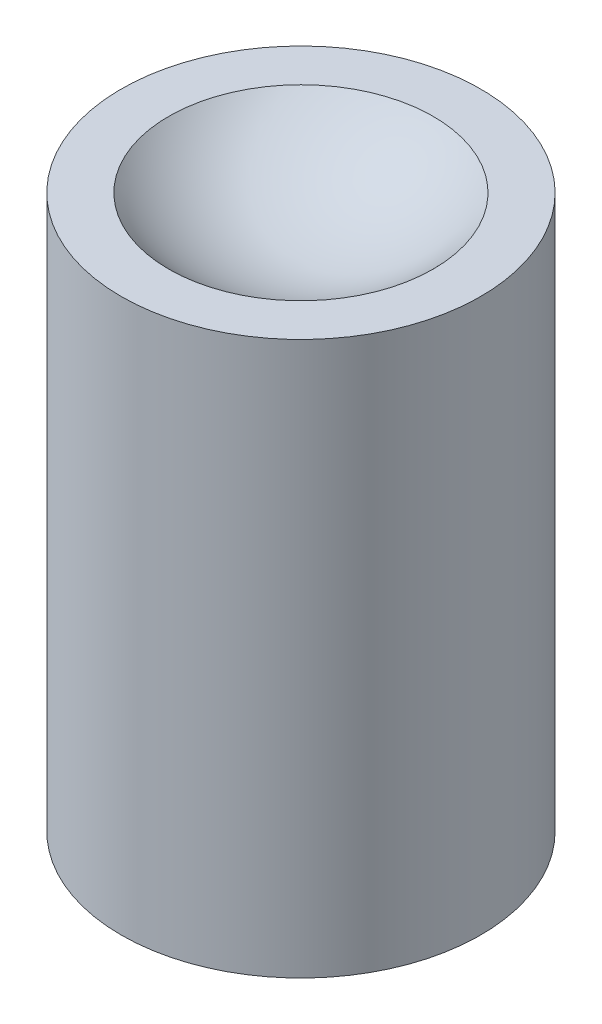
ISO-10303-21;
HEADER;
FILE_DESCRIPTION(('STEP AP214'),'2;1');
FILE_NAME('part.step','',(''),(''),'','','');
FILE_SCHEMA(('AUTOMOTIVE_DESIGN { 1 0 10303 214 1 1 1 1 }'));
ENDSEC;
DATA;
#1=APPLICATION_CONTEXT('core data for automotive mechanical design processes');
#2=APPLICATION_PROTOCOL_DEFINITION('international standard','automotive_design',2000,#1);
#3=PRODUCT_CONTEXT('',#1,'mechanical');
#4=PRODUCT('Part','Part','',(#3));
#5=PRODUCT_RELATED_PRODUCT_CATEGORY('part','',(#4));
#6=PRODUCT_DEFINITION_FORMATION('','',#4);
#7=PRODUCT_DEFINITION_CONTEXT('part definition',#1,'design');
#8=PRODUCT_DEFINITION('design','',#6,#7);
#9=PRODUCT_DEFINITION_SHAPE('','',#8);
#10=(LENGTH_UNIT() NAMED_UNIT(*) SI_UNIT(.MILLI.,.METRE.));
#11=(NAMED_UNIT(*) PLANE_ANGLE_UNIT() SI_UNIT($,.RADIAN.));
#12=(NAMED_UNIT(*) SI_UNIT($,.STERADIAN.) SOLID_ANGLE_UNIT());
#13=UNCERTAINTY_MEASURE_WITH_UNIT(LENGTH_MEASURE(1.E-05),#10,'distance_accuracy_value','');
#14=(GEOMETRIC_REPRESENTATION_CONTEXT(3) GLOBAL_UNCERTAINTY_ASSIGNED_CONTEXT((#13)) GLOBAL_UNIT_ASSIGNED_CONTEXT((#10,
#11,#12)) REPRESENTATION_CONTEXT('',''));
#15=CARTESIAN_POINT('',(0.,0.,0.));
#16=DIRECTION('',(0.,0.,1.));
#17=DIRECTION('',(1.,0.,0.));
#18=AXIS2_PLACEMENT_3D('',#15,#16,#17);
#19=CARTESIAN_POINT('',(0.,20.,0.));
#20=DIRECTION('',(0.,-1.,0.));
#21=DIRECTION('',(0.,0.,-1.));
#22=AXIS2_PLACEMENT_3D('',#19,#20,#21);
#23=CYLINDRICAL_SURFACE('',#22,6.5);
#24=CARTESIAN_POINT('',(0.,20.,0.));
#25=DIRECTION('',(0.,1.,0.));
#26=DIRECTION('',(0.,0.,1.));
#27=AXIS2_PLACEMENT_3D('',#24,#25,#26);
#28=CIRCLE('',#27,6.5);
#29=CARTESIAN_POINT('',(0.,20.,6.5));
#30=VERTEX_POINT('',#29);
#31=EDGE_CURVE('E10',#30,#30,#28,.T.);
#32=ORIENTED_EDGE('',*,*,#31,.F.);
#33=EDGE_LOOP('',(#32));
#34=FACE_BOUND('',#33,.T.);
#35=CARTESIAN_POINT('',(0.,0.,0.));
#36=DIRECTION('',(0.,1.,0.));
#37=DIRECTION('',(0.,0.,1.));
#38=AXIS2_PLACEMENT_3D('',#35,#36,#37);
#39=CIRCLE('',#38,6.5);
#40=CARTESIAN_POINT('',(0.,0.,6.5));
#41=VERTEX_POINT('',#40);
#42=EDGE_CURVE('E40',#41,#41,#39,.T.);
#43=ORIENTED_EDGE('',*,*,#42,.T.);
#44=EDGE_LOOP('',(#43));
#45=FACE_BOUND('',#44,.T.);
#46=ADVANCED_FACE('F33',(#34,#45),#23,.T.);
#47=CARTESIAN_POINT('',(0.,20.,0.));
#48=DIRECTION('',(0.,1.,0.));
#49=DIRECTION('',(0.,0.,1.));
#50=AXIS2_PLACEMENT_3D('',#47,#48,#49);
#51=PLANE('',#50);
#52=CARTESIAN_POINT('',(0.,20.,0.));
#53=DIRECTION('',(0.,1.,0.));
#54=DIRECTION('',(0.,0.,1.));
#55=AXIS2_PLACEMENT_3D('',#52,#53,#54);
#56=CIRCLE('',#55,4.78434948556227);
#57=CARTESIAN_POINT('',(0.,20.,4.78434948556227));
#58=VERTEX_POINT('',#57);
#59=EDGE_CURVE('E36',#58,#58,#56,.T.);
#60=ORIENTED_EDGE('',*,*,#59,.F.);
#61=EDGE_LOOP('',(#60));
#62=FACE_BOUND('',#61,.T.);
#63=ORIENTED_EDGE('',*,*,#31,.T.);
#64=EDGE_LOOP('',(#63));
#65=FACE_BOUND('',#64,.T.);
#66=ADVANCED_FACE('F64',(#62,#65),#51,.T.);
#67=CARTESIAN_POINT('',(0.,0.,0.));
#68=DIRECTION('',(0.,1.,0.));
#69=DIRECTION('',(0.,0.,1.));
#70=AXIS2_PLACEMENT_3D('',#67,#68,#69);
#71=PLANE('',#70);
#72=CARTESIAN_POINT('',(0.,0.,0.));
#73=DIRECTION('',(0.,-1.,0.));
#74=DIRECTION('',(0.,0.,-1.));
#75=AXIS2_PLACEMENT_3D('',#72,#73,#74);
#76=CIRCLE('',#75,2.);
#77=CARTESIAN_POINT('',(0.,0.,-2.));
#78=VERTEX_POINT('',#77);
#79=EDGE_CURVE('E47',#78,#78,#76,.T.);
#80=ORIENTED_EDGE('',*,*,#79,.F.);
#81=EDGE_LOOP('',(#80));
#82=FACE_BOUND('',#81,.T.);
#83=ORIENTED_EDGE('',*,*,#42,.F.);
#84=EDGE_LOOP('',(#83));
#85=FACE_BOUND('',#84,.T.);
#86=ADVANCED_FACE('F58',(#82,#85),#71,.F.);
#87=CARTESIAN_POINT('',(0.,7.,0.));
#88=DIRECTION('',(0.,-1.,0.));
#89=DIRECTION('',(0.,0.,-1.));
#90=AXIS2_PLACEMENT_3D('',#87,#88,#89);
#91=CYLINDRICAL_SURFACE('',#90,2.);
#92=CARTESIAN_POINT('',(0.,7.,0.));
#93=DIRECTION('',(0.,-1.,0.));
#94=DIRECTION('',(0.,0.,-1.));
#95=AXIS2_PLACEMENT_3D('',#92,#93,#94);
#96=CIRCLE('',#95,2.);
#97=CARTESIAN_POINT('',(0.,7.,-2.));
#98=VERTEX_POINT('',#97);
#99=EDGE_CURVE('E45',#98,#98,#96,.T.);
#100=ORIENTED_EDGE('',*,*,#99,.F.);
#101=EDGE_LOOP('',(#100));
#102=FACE_BOUND('',#101,.T.);
#103=ORIENTED_EDGE('',*,*,#79,.T.);
#104=EDGE_LOOP('',(#103));
#105=FACE_BOUND('',#104,.T.);
#106=ADVANCED_FACE('F55',(#102,#105),#91,.F.);
#107=CARTESIAN_POINT('',(0.,7.,0.));
#108=DIRECTION('',(0.,-1.,0.));
#109=DIRECTION('',(0.,0.,-1.));
#110=AXIS2_PLACEMENT_3D('',#107,#108,#109);
#111=PLANE('',#110);
#112=ORIENTED_EDGE('',*,*,#99,.T.);
#113=EDGE_LOOP('',(#112));
#114=FACE_BOUND('',#113,.T.);
#115=ADVANCED_FACE('F53',(#114),#111,.T.);
#116=CARTESIAN_POINT('',(0.,24.4,0.));
#117=DIRECTION('',(0.,1.,0.));
#118=DIRECTION('',(1.,0.,0.));
#119=AXIS2_PLACEMENT_3D('',#116,#117,#118);
#120=SPHERICAL_SURFACE('',#119,6.5);
#121=ORIENTED_EDGE('',*,*,#59,.T.);
#122=EDGE_LOOP('',(#121));
#123=FACE_BOUND('',#122,.T.);
#124=ADVANCED_FACE('F80',(#123),#120,.F.);
#125=CLOSED_SHELL('',(#46,#66,#86,#106,#115,#124));
#126=MANIFOLD_SOLID_BREP('B2',#125);
#127=ADVANCED_BREP_SHAPE_REPRESENTATION('',(#18,#126),#14);
#128=SHAPE_DEFINITION_REPRESENTATION(#9,#127);
ENDSEC;
END-ISO-10303-21;
